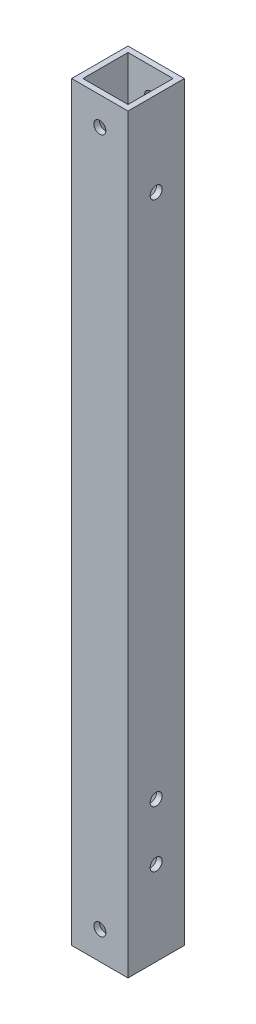
ISO-10303-21;
HEADER;
FILE_DESCRIPTION(('STEP AP214'),'2;1');
FILE_NAME('part.step','',(''),(''),'','','');
FILE_SCHEMA(('AUTOMOTIVE_DESIGN { 1 0 10303 214 1 1 1 1 }'));
ENDSEC;
DATA;
#1=APPLICATION_CONTEXT('core data for automotive mechanical design processes');
#2=APPLICATION_PROTOCOL_DEFINITION('international standard','automotive_design',2000,#1);
#3=PRODUCT_CONTEXT('',#1,'mechanical');
#4=PRODUCT('Part','Part','',(#3));
#5=PRODUCT_RELATED_PRODUCT_CATEGORY('part','',(#4));
#6=PRODUCT_DEFINITION_FORMATION('','',#4);
#7=PRODUCT_DEFINITION_CONTEXT('part definition',#1,'design');
#8=PRODUCT_DEFINITION('design','',#6,#7);
#9=PRODUCT_DEFINITION_SHAPE('','',#8);
#10=(LENGTH_UNIT() NAMED_UNIT(*) SI_UNIT(.MILLI.,.METRE.));
#11=(NAMED_UNIT(*) PLANE_ANGLE_UNIT() SI_UNIT($,.RADIAN.));
#12=(NAMED_UNIT(*) SI_UNIT($,.STERADIAN.) SOLID_ANGLE_UNIT());
#13=UNCERTAINTY_MEASURE_WITH_UNIT(LENGTH_MEASURE(1.E-05),#10,'distance_accuracy_value','');
#14=(GEOMETRIC_REPRESENTATION_CONTEXT(3) GLOBAL_UNCERTAINTY_ASSIGNED_CONTEXT((#13)) GLOBAL_UNIT_ASSIGNED_CONTEXT((#10,
#11,#12)) REPRESENTATION_CONTEXT('',''));
#15=CARTESIAN_POINT('',(0.,0.,0.));
#16=DIRECTION('',(0.,0.,1.));
#17=DIRECTION('',(1.,0.,0.));
#18=AXIS2_PLACEMENT_3D('',#15,#16,#17);
#19=CARTESIAN_POINT('',(0.,200.,0.));
#20=DIRECTION('',(0.,1.,0.));
#21=DIRECTION('',(0.,0.,1.));
#22=AXIS2_PLACEMENT_3D('',#19,#20,#21);
#23=PLANE('',#22);
#24=DIRECTION('',(0.,0.,-1.));
#25=VECTOR('',#24,1.);
#26=CARTESIAN_POINT('',(7.5,200.,-7.5));
#27=LINE('',#26,#25);
#28=CARTESIAN_POINT('',(7.5,200.,7.5));
#29=VERTEX_POINT('',#28);
#30=CARTESIAN_POINT('',(7.5,200.,-7.5));
#31=VERTEX_POINT('',#30);
#32=EDGE_CURVE('E156',#29,#31,#27,.T.);
#33=ORIENTED_EDGE('',*,*,#32,.T.);
#34=DIRECTION('',(-1.,0.,0.));
#35=VECTOR('',#34,1.);
#36=CARTESIAN_POINT('',(-7.5,200.,-7.5));
#37=LINE('',#36,#35);
#38=CARTESIAN_POINT('',(-7.5,200.,-7.5));
#39=VERTEX_POINT('',#38);
#40=EDGE_CURVE('E160',#31,#39,#37,.T.);
#41=ORIENTED_EDGE('',*,*,#40,.T.);
#42=DIRECTION('',(0.,0.,1.));
#43=VECTOR('',#42,1.);
#44=CARTESIAN_POINT('',(-7.5,200.,-7.5));
#45=LINE('',#44,#43);
#46=CARTESIAN_POINT('',(-7.5,200.,7.5));
#47=VERTEX_POINT('',#46);
#48=EDGE_CURVE('E164',#39,#47,#45,.T.);
#49=ORIENTED_EDGE('',*,*,#48,.T.);
#50=DIRECTION('',(1.,0.,0.));
#51=VECTOR('',#50,1.);
#52=CARTESIAN_POINT('',(-7.5,200.,7.5));
#53=LINE('',#52,#51);
#54=EDGE_CURVE('E167',#47,#29,#53,.T.);
#55=ORIENTED_EDGE('',*,*,#54,.T.);
#56=EDGE_LOOP('',(#33,#41,#49,#55));
#57=FACE_BOUND('',#56,.T.);
#58=DIRECTION('',(1.,0.,0.));
#59=VECTOR('',#58,1.);
#60=CARTESIAN_POINT('',(-6.,200.,6.));
#61=LINE('',#60,#59);
#62=CARTESIAN_POINT('',(-6.,200.,6.));
#63=VERTEX_POINT('',#62);
#64=CARTESIAN_POINT('',(6.,200.,6.));
#65=VERTEX_POINT('',#64);
#66=EDGE_CURVE('E115',#63,#65,#61,.T.);
#67=ORIENTED_EDGE('',*,*,#66,.F.);
#68=DIRECTION('',(0.,0.,1.));
#69=VECTOR('',#68,1.);
#70=CARTESIAN_POINT('',(-6.,200.,-6.));
#71=LINE('',#70,#69);
#72=CARTESIAN_POINT('',(-6.,200.,-6.));
#73=VERTEX_POINT('',#72);
#74=EDGE_CURVE('E106',#73,#63,#71,.T.);
#75=ORIENTED_EDGE('',*,*,#74,.F.);
#76=DIRECTION('',(-1.,0.,0.));
#77=VECTOR('',#76,1.);
#78=CARTESIAN_POINT('',(-6.,200.,-6.));
#79=LINE('',#78,#77);
#80=CARTESIAN_POINT('',(6.,200.,-6.));
#81=VERTEX_POINT('',#80);
#82=EDGE_CURVE('E132',#81,#73,#79,.T.);
#83=ORIENTED_EDGE('',*,*,#82,.F.);
#84=DIRECTION('',(0.,0.,-1.));
#85=VECTOR('',#84,1.);
#86=CARTESIAN_POINT('',(6.,200.,-6.));
#87=LINE('',#86,#85);
#88=EDGE_CURVE('E128',#65,#81,#87,.T.);
#89=ORIENTED_EDGE('',*,*,#88,.F.);
#90=EDGE_LOOP('',(#67,#75,#83,#89));
#91=FACE_BOUND('',#90,.T.);
#92=ADVANCED_FACE('F38',(#57,#91),#23,.T.);
#93=CARTESIAN_POINT('',(0.,0.,0.));
#94=DIRECTION('',(0.,1.,0.));
#95=DIRECTION('',(0.,0.,1.));
#96=AXIS2_PLACEMENT_3D('',#93,#94,#95);
#97=PLANE('',#96);
#98=DIRECTION('',(0.,0.,-1.));
#99=VECTOR('',#98,1.);
#100=CARTESIAN_POINT('',(7.5,0.,-7.5));
#101=LINE('',#100,#99);
#102=CARTESIAN_POINT('',(7.5,0.,7.5));
#103=VERTEX_POINT('',#102);
#104=CARTESIAN_POINT('',(7.5,0.,-7.5));
#105=VERTEX_POINT('',#104);
#106=EDGE_CURVE('E124',#103,#105,#101,.T.);
#107=ORIENTED_EDGE('',*,*,#106,.F.);
#108=DIRECTION('',(1.,0.,0.));
#109=VECTOR('',#108,1.);
#110=CARTESIAN_POINT('',(-7.5,0.,7.5));
#111=LINE('',#110,#109);
#112=CARTESIAN_POINT('',(-7.5,0.,7.5));
#113=VERTEX_POINT('',#112);
#114=EDGE_CURVE('E161',#113,#103,#111,.T.);
#115=ORIENTED_EDGE('',*,*,#114,.F.);
#116=DIRECTION('',(0.,0.,1.));
#117=VECTOR('',#116,1.);
#118=CARTESIAN_POINT('',(-7.5,0.,-7.5));
#119=LINE('',#118,#117);
#120=CARTESIAN_POINT('',(-7.5,0.,-7.5));
#121=VERTEX_POINT('',#120);
#122=EDGE_CURVE('E177',#121,#113,#119,.T.);
#123=ORIENTED_EDGE('',*,*,#122,.F.);
#124=DIRECTION('',(-1.,0.,0.));
#125=VECTOR('',#124,1.);
#126=CARTESIAN_POINT('',(-7.5,0.,-7.5));
#127=LINE('',#126,#125);
#128=EDGE_CURVE('E174',#105,#121,#127,.T.);
#129=ORIENTED_EDGE('',*,*,#128,.F.);
#130=EDGE_LOOP('',(#107,#115,#123,#129));
#131=FACE_BOUND('',#130,.T.);
#132=DIRECTION('',(0.,0.,1.));
#133=VECTOR('',#132,1.);
#134=CARTESIAN_POINT('',(-6.,0.,-6.));
#135=LINE('',#134,#133);
#136=CARTESIAN_POINT('',(-6.,0.,-6.));
#137=VERTEX_POINT('',#136);
#138=CARTESIAN_POINT('',(-6.,0.,6.));
#139=VERTEX_POINT('',#138);
#140=EDGE_CURVE('E64',#137,#139,#135,.T.);
#141=ORIENTED_EDGE('',*,*,#140,.T.);
#142=DIRECTION('',(1.,0.,0.));
#143=VECTOR('',#142,1.);
#144=CARTESIAN_POINT('',(-6.,0.,6.));
#145=LINE('',#144,#143);
#146=CARTESIAN_POINT('',(6.,0.,6.));
#147=VERTEX_POINT('',#146);
#148=EDGE_CURVE('E122',#139,#147,#145,.T.);
#149=ORIENTED_EDGE('',*,*,#148,.T.);
#150=DIRECTION('',(0.,0.,-1.));
#151=VECTOR('',#150,1.);
#152=CARTESIAN_POINT('',(6.,0.,-6.));
#153=LINE('',#152,#151);
#154=CARTESIAN_POINT('',(6.,0.,-6.));
#155=VERTEX_POINT('',#154);
#156=EDGE_CURVE('E143',#147,#155,#153,.T.);
#157=ORIENTED_EDGE('',*,*,#156,.T.);
#158=DIRECTION('',(-1.,0.,0.));
#159=VECTOR('',#158,1.);
#160=CARTESIAN_POINT('',(-6.,0.,-6.));
#161=LINE('',#160,#159);
#162=EDGE_CURVE('E116',#155,#137,#161,.T.);
#163=ORIENTED_EDGE('',*,*,#162,.T.);
#164=EDGE_LOOP('',(#141,#149,#157,#163));
#165=FACE_BOUND('',#164,.T.);
#166=ADVANCED_FACE('F283',(#131,#165),#97,.F.);
#167=CARTESIAN_POINT('',(7.5,200.,-7.5));
#168=DIRECTION('',(-1.,0.,0.));
#169=DIRECTION('',(0.,0.,1.));
#170=AXIS2_PLACEMENT_3D('',#167,#168,#169);
#171=PLANE('',#170);
#172=CARTESIAN_POINT('',(7.5,177.5,0.));
#173=DIRECTION('',(1.,0.,0.));
#174=DIRECTION('',(0.,0.,-1.));
#175=AXIS2_PLACEMENT_3D('',#172,#173,#174);
#176=CIRCLE('',#175,1.59999999999999);
#177=CARTESIAN_POINT('',(7.5,177.5,-1.59999999999999));
#178=VERTEX_POINT('',#177);
#179=EDGE_CURVE('E351',#178,#178,#176,.T.);
#180=ORIENTED_EDGE('',*,*,#179,.F.);
#181=EDGE_LOOP('',(#180));
#182=FACE_BOUND('',#181,.T.);
#183=CARTESIAN_POINT('',(7.5,22.5,0.));
#184=DIRECTION('',(1.,0.,0.));
#185=DIRECTION('',(0.,0.,-1.));
#186=AXIS2_PLACEMENT_3D('',#183,#184,#185);
#187=CIRCLE('',#186,1.6);
#188=CARTESIAN_POINT('',(7.5,22.5,-1.6));
#189=VERTEX_POINT('',#188);
#190=EDGE_CURVE('E361',#189,#189,#187,.T.);
#191=ORIENTED_EDGE('',*,*,#190,.F.);
#192=EDGE_LOOP('',(#191));
#193=FACE_BOUND('',#192,.T.);
#194=CARTESIAN_POINT('',(7.5,37.5,0.));
#195=DIRECTION('',(1.,0.,0.));
#196=DIRECTION('',(0.,0.,-1.));
#197=AXIS2_PLACEMENT_3D('',#194,#195,#196);
#198=CIRCLE('',#197,1.6);
#199=CARTESIAN_POINT('',(7.5,37.5,-1.6));
#200=VERTEX_POINT('',#199);
#201=EDGE_CURVE('E222',#200,#200,#198,.T.);
#202=ORIENTED_EDGE('',*,*,#201,.F.);
#203=EDGE_LOOP('',(#202));
#204=FACE_BOUND('',#203,.T.);
#205=ORIENTED_EDGE('',*,*,#106,.T.);
#206=DIRECTION('',(0.,-1.,0.));
#207=VECTOR('',#206,1.);
#208=CARTESIAN_POINT('',(7.5,200.,-7.5));
#209=LINE('',#208,#207);
#210=EDGE_CURVE('E11',#31,#105,#209,.T.);
#211=ORIENTED_EDGE('',*,*,#210,.F.);
#212=ORIENTED_EDGE('',*,*,#32,.F.);
#213=DIRECTION('',(0.,-1.,0.));
#214=VECTOR('',#213,1.);
#215=CARTESIAN_POINT('',(7.5,200.,7.5));
#216=LINE('',#215,#214);
#217=EDGE_CURVE('E170',#29,#103,#216,.T.);
#218=ORIENTED_EDGE('',*,*,#217,.T.);
#219=EDGE_LOOP('',(#205,#211,#212,#218));
#220=FACE_BOUND('',#219,.T.);
#221=ADVANCED_FACE('F40',(#182,#193,#204,#220),#171,.F.);
#222=CARTESIAN_POINT('',(-7.5,200.,-7.5));
#223=DIRECTION('',(0.,0.,1.));
#224=DIRECTION('',(1.,0.,0.));
#225=AXIS2_PLACEMENT_3D('',#222,#223,#224);
#226=PLANE('',#225);
#227=CARTESIAN_POINT('',(0.,192.5,-7.5));
#228=DIRECTION('',(0.,0.,1.));
#229=DIRECTION('',(1.,0.,0.));
#230=AXIS2_PLACEMENT_3D('',#227,#228,#229);
#231=CIRCLE('',#230,1.59999999999999);
#232=CARTESIAN_POINT('',(1.59999999999999,192.5,-7.5));
#233=VERTEX_POINT('',#232);
#234=EDGE_CURVE('E197',#233,#233,#231,.T.);
#235=ORIENTED_EDGE('',*,*,#234,.T.);
#236=EDGE_LOOP('',(#235));
#237=FACE_BOUND('',#236,.T.);
#238=CARTESIAN_POINT('',(0.,7.5,-7.5));
#239=DIRECTION('',(0.,0.,1.));
#240=DIRECTION('',(1.,0.,0.));
#241=AXIS2_PLACEMENT_3D('',#238,#239,#240);
#242=CIRCLE('',#241,1.6);
#243=CARTESIAN_POINT('',(1.6,7.5,-7.5));
#244=VERTEX_POINT('',#243);
#245=EDGE_CURVE('E237',#244,#244,#242,.T.);
#246=ORIENTED_EDGE('',*,*,#245,.T.);
#247=EDGE_LOOP('',(#246));
#248=FACE_BOUND('',#247,.T.);
#249=ORIENTED_EDGE('',*,*,#128,.T.);
#250=DIRECTION('',(0.,-1.,0.));
#251=VECTOR('',#250,1.);
#252=CARTESIAN_POINT('',(-7.5,200.,-7.5));
#253=LINE('',#252,#251);
#254=EDGE_CURVE('E48',#39,#121,#253,.T.);
#255=ORIENTED_EDGE('',*,*,#254,.F.);
#256=ORIENTED_EDGE('',*,*,#40,.F.);
#257=ORIENTED_EDGE('',*,*,#210,.T.);
#258=EDGE_LOOP('',(#249,#255,#256,#257));
#259=FACE_BOUND('',#258,.T.);
#260=ADVANCED_FACE('F287',(#237,#248,#259),#226,.F.);
#261=CARTESIAN_POINT('',(-7.5,200.,-7.5));
#262=DIRECTION('',(1.,0.,0.));
#263=DIRECTION('',(0.,0.,-1.));
#264=AXIS2_PLACEMENT_3D('',#261,#262,#263);
#265=PLANE('',#264);
#266=CARTESIAN_POINT('',(-7.5,177.5,0.));
#267=DIRECTION('',(1.,0.,0.));
#268=DIRECTION('',(0.,0.,-1.));
#269=AXIS2_PLACEMENT_3D('',#266,#267,#268);
#270=CIRCLE('',#269,1.59999999999999);
#271=CARTESIAN_POINT('',(-7.5,177.5,-1.59999999999999));
#272=VERTEX_POINT('',#271);
#273=EDGE_CURVE('E206',#272,#272,#270,.T.);
#274=ORIENTED_EDGE('',*,*,#273,.T.);
#275=EDGE_LOOP('',(#274));
#276=FACE_BOUND('',#275,.T.);
#277=CARTESIAN_POINT('',(-7.5,22.5,0.));
#278=DIRECTION('',(1.,0.,0.));
#279=DIRECTION('',(0.,0.,-1.));
#280=AXIS2_PLACEMENT_3D('',#277,#278,#279);
#281=CIRCLE('',#280,1.6);
#282=CARTESIAN_POINT('',(-7.5,22.5,-1.6));
#283=VERTEX_POINT('',#282);
#284=EDGE_CURVE('E355',#283,#283,#281,.T.);
#285=ORIENTED_EDGE('',*,*,#284,.T.);
#286=EDGE_LOOP('',(#285));
#287=FACE_BOUND('',#286,.T.);
#288=CARTESIAN_POINT('',(-7.5,37.5,0.));
#289=DIRECTION('',(1.,0.,0.));
#290=DIRECTION('',(0.,0.,-1.));
#291=AXIS2_PLACEMENT_3D('',#288,#289,#290);
#292=CIRCLE('',#291,1.6);
#293=CARTESIAN_POINT('',(-7.5,37.5,-1.6));
#294=VERTEX_POINT('',#293);
#295=EDGE_CURVE('E364',#294,#294,#292,.T.);
#296=ORIENTED_EDGE('',*,*,#295,.T.);
#297=EDGE_LOOP('',(#296));
#298=FACE_BOUND('',#297,.T.);
#299=ORIENTED_EDGE('',*,*,#122,.T.);
#300=DIRECTION('',(0.,-1.,0.));
#301=VECTOR('',#300,1.);
#302=CARTESIAN_POINT('',(-7.5,200.,7.5));
#303=LINE('',#302,#301);
#304=EDGE_CURVE('E185',#47,#113,#303,.T.);
#305=ORIENTED_EDGE('',*,*,#304,.F.);
#306=ORIENTED_EDGE('',*,*,#48,.F.);
#307=ORIENTED_EDGE('',*,*,#254,.T.);
#308=EDGE_LOOP('',(#299,#305,#306,#307));
#309=FACE_BOUND('',#308,.T.);
#310=ADVANCED_FACE('F270',(#276,#287,#298,#309),#265,.F.);
#311=CARTESIAN_POINT('',(-7.5,200.,7.5));
#312=DIRECTION('',(0.,0.,-1.));
#313=DIRECTION('',(-1.,0.,0.));
#314=AXIS2_PLACEMENT_3D('',#311,#312,#313);
#315=PLANE('',#314);
#316=CARTESIAN_POINT('',(0.,192.5,7.5));
#317=DIRECTION('',(0.,0.,1.));
#318=DIRECTION('',(1.,0.,0.));
#319=AXIS2_PLACEMENT_3D('',#316,#317,#318);
#320=CIRCLE('',#319,1.59999999999999);
#321=CARTESIAN_POINT('',(1.59999999999999,192.5,7.5));
#322=VERTEX_POINT('',#321);
#323=EDGE_CURVE('E233',#322,#322,#320,.T.);
#324=ORIENTED_EDGE('',*,*,#323,.F.);
#325=EDGE_LOOP('',(#324));
#326=FACE_BOUND('',#325,.T.);
#327=CARTESIAN_POINT('',(0.,7.5,7.5));
#328=DIRECTION('',(0.,0.,1.));
#329=DIRECTION('',(1.,0.,0.));
#330=AXIS2_PLACEMENT_3D('',#327,#328,#329);
#331=CIRCLE('',#330,1.6);
#332=CARTESIAN_POINT('',(1.6,7.5,7.5));
#333=VERTEX_POINT('',#332);
#334=EDGE_CURVE('E229',#333,#333,#331,.T.);
#335=ORIENTED_EDGE('',*,*,#334,.F.);
#336=EDGE_LOOP('',(#335));
#337=FACE_BOUND('',#336,.T.);
#338=ORIENTED_EDGE('',*,*,#114,.T.);
#339=ORIENTED_EDGE('',*,*,#217,.F.);
#340=ORIENTED_EDGE('',*,*,#54,.F.);
#341=ORIENTED_EDGE('',*,*,#304,.T.);
#342=EDGE_LOOP('',(#338,#339,#340,#341));
#343=FACE_BOUND('',#342,.T.);
#344=ADVANCED_FACE('F267',(#326,#337,#343),#315,.F.);
#345=CARTESIAN_POINT('',(-6.,200.,-6.));
#346=DIRECTION('',(1.,0.,0.));
#347=DIRECTION('',(0.,0.,-1.));
#348=AXIS2_PLACEMENT_3D('',#345,#346,#347);
#349=PLANE('',#348);
#350=CARTESIAN_POINT('',(-6.,177.5,0.));
#351=DIRECTION('',(1.,0.,0.));
#352=DIRECTION('',(0.,0.,-1.));
#353=AXIS2_PLACEMENT_3D('',#350,#351,#352);
#354=CIRCLE('',#353,1.59999999999999);
#355=CARTESIAN_POINT('',(-6.,177.5,-1.59999999999999));
#356=VERTEX_POINT('',#355);
#357=EDGE_CURVE('E225',#356,#356,#354,.T.);
#358=ORIENTED_EDGE('',*,*,#357,.F.);
#359=EDGE_LOOP('',(#358));
#360=FACE_BOUND('',#359,.T.);
#361=CARTESIAN_POINT('',(-6.,22.5,0.));
#362=DIRECTION('',(1.,0.,0.));
#363=DIRECTION('',(0.,0.,-1.));
#364=AXIS2_PLACEMENT_3D('',#361,#362,#363);
#365=CIRCLE('',#364,1.6);
#366=CARTESIAN_POINT('',(-6.,22.5,-1.6));
#367=VERTEX_POINT('',#366);
#368=EDGE_CURVE('E210',#367,#367,#365,.T.);
#369=ORIENTED_EDGE('',*,*,#368,.F.);
#370=EDGE_LOOP('',(#369));
#371=FACE_BOUND('',#370,.T.);
#372=CARTESIAN_POINT('',(-6.,37.5,0.));
#373=DIRECTION('',(1.,0.,0.));
#374=DIRECTION('',(0.,0.,-1.));
#375=AXIS2_PLACEMENT_3D('',#372,#373,#374);
#376=CIRCLE('',#375,1.6);
#377=CARTESIAN_POINT('',(-6.,37.5,-1.6));
#378=VERTEX_POINT('',#377);
#379=EDGE_CURVE('E205',#378,#378,#376,.T.);
#380=ORIENTED_EDGE('',*,*,#379,.F.);
#381=EDGE_LOOP('',(#380));
#382=FACE_BOUND('',#381,.T.);
#383=ORIENTED_EDGE('',*,*,#140,.F.);
#384=DIRECTION('',(0.,-1.,0.));
#385=VECTOR('',#384,1.);
#386=CARTESIAN_POINT('',(-6.,200.,-6.));
#387=LINE('',#386,#385);
#388=EDGE_CURVE('E110',#73,#137,#387,.T.);
#389=ORIENTED_EDGE('',*,*,#388,.F.);
#390=ORIENTED_EDGE('',*,*,#74,.T.);
#391=DIRECTION('',(0.,-1.,0.));
#392=VECTOR('',#391,1.);
#393=CARTESIAN_POINT('',(-6.,200.,6.));
#394=LINE('',#393,#392);
#395=EDGE_CURVE('E109',#63,#139,#394,.T.);
#396=ORIENTED_EDGE('',*,*,#395,.T.);
#397=EDGE_LOOP('',(#383,#389,#390,#396));
#398=FACE_BOUND('',#397,.T.);
#399=ADVANCED_FACE('F108',(#360,#371,#382,#398),#349,.T.);
#400=CARTESIAN_POINT('',(-6.,200.,6.));
#401=DIRECTION('',(0.,0.,-1.));
#402=DIRECTION('',(-1.,0.,0.));
#403=AXIS2_PLACEMENT_3D('',#400,#401,#402);
#404=PLANE('',#403);
#405=CARTESIAN_POINT('',(0.,192.5,6.));
#406=DIRECTION('',(0.,0.,-1.));
#407=DIRECTION('',(-1.,0.,0.));
#408=AXIS2_PLACEMENT_3D('',#405,#406,#407);
#409=CIRCLE('',#408,1.59999999999999);
#410=CARTESIAN_POINT('',(-1.59999999999999,192.5,6.));
#411=VERTEX_POINT('',#410);
#412=EDGE_CURVE('E140',#411,#411,#409,.T.);
#413=ORIENTED_EDGE('',*,*,#412,.F.);
#414=EDGE_LOOP('',(#413));
#415=FACE_BOUND('',#414,.T.);
#416=CARTESIAN_POINT('',(0.,7.5,6.));
#417=DIRECTION('',(0.,0.,-1.));
#418=DIRECTION('',(-1.,0.,0.));
#419=AXIS2_PLACEMENT_3D('',#416,#417,#418);
#420=CIRCLE('',#419,1.6);
#421=CARTESIAN_POINT('',(-1.6,7.5,6.));
#422=VERTEX_POINT('',#421);
#423=EDGE_CURVE('E196',#422,#422,#420,.T.);
#424=ORIENTED_EDGE('',*,*,#423,.F.);
#425=EDGE_LOOP('',(#424));
#426=FACE_BOUND('',#425,.T.);
#427=ORIENTED_EDGE('',*,*,#148,.F.);
#428=ORIENTED_EDGE('',*,*,#395,.F.);
#429=ORIENTED_EDGE('',*,*,#66,.T.);
#430=DIRECTION('',(0.,-1.,0.));
#431=VECTOR('',#430,1.);
#432=CARTESIAN_POINT('',(6.,200.,6.));
#433=LINE('',#432,#431);
#434=EDGE_CURVE('E125',#65,#147,#433,.T.);
#435=ORIENTED_EDGE('',*,*,#434,.T.);
#436=EDGE_LOOP('',(#427,#428,#429,#435));
#437=FACE_BOUND('',#436,.T.);
#438=ADVANCED_FACE('F119',(#415,#426,#437),#404,.T.);
#439=CARTESIAN_POINT('',(6.,200.,-6.));
#440=DIRECTION('',(-1.,0.,0.));
#441=DIRECTION('',(0.,0.,1.));
#442=AXIS2_PLACEMENT_3D('',#439,#440,#441);
#443=PLANE('',#442);
#444=CARTESIAN_POINT('',(6.,177.5,0.));
#445=DIRECTION('',(-1.,0.,0.));
#446=DIRECTION('',(0.,0.,1.));
#447=AXIS2_PLACEMENT_3D('',#444,#445,#446);
#448=CIRCLE('',#447,1.59999999999999);
#449=CARTESIAN_POINT('',(6.,177.5,1.59999999999999));
#450=VERTEX_POINT('',#449);
#451=EDGE_CURVE('E42',#450,#450,#448,.T.);
#452=ORIENTED_EDGE('',*,*,#451,.F.);
#453=EDGE_LOOP('',(#452));
#454=FACE_BOUND('',#453,.T.);
#455=CARTESIAN_POINT('',(6.,22.5,0.));
#456=DIRECTION('',(-1.,0.,0.));
#457=DIRECTION('',(0.,0.,1.));
#458=AXIS2_PLACEMENT_3D('',#455,#456,#457);
#459=CIRCLE('',#458,1.6);
#460=CARTESIAN_POINT('',(6.,22.5,1.6));
#461=VERTEX_POINT('',#460);
#462=EDGE_CURVE('E207',#461,#461,#459,.T.);
#463=ORIENTED_EDGE('',*,*,#462,.F.);
#464=EDGE_LOOP('',(#463));
#465=FACE_BOUND('',#464,.T.);
#466=CARTESIAN_POINT('',(6.,37.5,0.));
#467=DIRECTION('',(-1.,0.,0.));
#468=DIRECTION('',(0.,0.,1.));
#469=AXIS2_PLACEMENT_3D('',#466,#467,#468);
#470=CIRCLE('',#469,1.6);
#471=CARTESIAN_POINT('',(6.,37.5,1.6));
#472=VERTEX_POINT('',#471);
#473=EDGE_CURVE('E202',#472,#472,#470,.T.);
#474=ORIENTED_EDGE('',*,*,#473,.F.);
#475=EDGE_LOOP('',(#474));
#476=FACE_BOUND('',#475,.T.);
#477=ORIENTED_EDGE('',*,*,#156,.F.);
#478=ORIENTED_EDGE('',*,*,#434,.F.);
#479=ORIENTED_EDGE('',*,*,#88,.T.);
#480=DIRECTION('',(0.,-1.,0.));
#481=VECTOR('',#480,1.);
#482=CARTESIAN_POINT('',(6.,200.,-6.));
#483=LINE('',#482,#481);
#484=EDGE_CURVE('E56',#81,#155,#483,.T.);
#485=ORIENTED_EDGE('',*,*,#484,.T.);
#486=EDGE_LOOP('',(#477,#478,#479,#485));
#487=FACE_BOUND('',#486,.T.);
#488=ADVANCED_FACE('F255',(#454,#465,#476,#487),#443,.T.);
#489=CARTESIAN_POINT('',(-6.,200.,-6.));
#490=DIRECTION('',(0.,0.,1.));
#491=DIRECTION('',(1.,0.,0.));
#492=AXIS2_PLACEMENT_3D('',#489,#490,#491);
#493=PLANE('',#492);
#494=CARTESIAN_POINT('',(0.,192.5,-6.));
#495=DIRECTION('',(0.,0.,1.));
#496=DIRECTION('',(1.,0.,0.));
#497=AXIS2_PLACEMENT_3D('',#494,#495,#496);
#498=CIRCLE('',#497,1.59999999999999);
#499=CARTESIAN_POINT('',(1.59999999999999,192.5,-6.));
#500=VERTEX_POINT('',#499);
#501=EDGE_CURVE('E198',#500,#500,#498,.T.);
#502=ORIENTED_EDGE('',*,*,#501,.F.);
#503=EDGE_LOOP('',(#502));
#504=FACE_BOUND('',#503,.T.);
#505=CARTESIAN_POINT('',(0.,7.5,-6.));
#506=DIRECTION('',(0.,0.,1.));
#507=DIRECTION('',(1.,0.,0.));
#508=AXIS2_PLACEMENT_3D('',#505,#506,#507);
#509=CIRCLE('',#508,1.6);
#510=CARTESIAN_POINT('',(1.6,7.5,-6.));
#511=VERTEX_POINT('',#510);
#512=EDGE_CURVE('E192',#511,#511,#509,.T.);
#513=ORIENTED_EDGE('',*,*,#512,.F.);
#514=EDGE_LOOP('',(#513));
#515=FACE_BOUND('',#514,.T.);
#516=ORIENTED_EDGE('',*,*,#162,.F.);
#517=ORIENTED_EDGE('',*,*,#484,.F.);
#518=ORIENTED_EDGE('',*,*,#82,.T.);
#519=ORIENTED_EDGE('',*,*,#388,.T.);
#520=EDGE_LOOP('',(#516,#517,#518,#519));
#521=FACE_BOUND('',#520,.T.);
#522=ADVANCED_FACE('F313',(#504,#515,#521),#493,.T.);
#523=CARTESIAN_POINT('',(0.,7.5,-7.5));
#524=DIRECTION('',(0.,0.,1.));
#525=DIRECTION('',(1.,0.,0.));
#526=AXIS2_PLACEMENT_3D('',#523,#524,#525);
#527=CYLINDRICAL_SURFACE('',#526,1.6);
#528=ORIENTED_EDGE('',*,*,#512,.T.);
#529=EDGE_LOOP('',(#528));
#530=FACE_BOUND('',#529,.T.);
#531=ORIENTED_EDGE('',*,*,#245,.F.);
#532=EDGE_LOOP('',(#531));
#533=FACE_BOUND('',#532,.T.);
#534=ADVANCED_FACE('F264',(#530,#533),#527,.F.);
#535=CARTESIAN_POINT('',(0.,192.5,-7.5));
#536=DIRECTION('',(0.,0.,1.));
#537=DIRECTION('',(1.,0.,0.));
#538=AXIS2_PLACEMENT_3D('',#535,#536,#537);
#539=CYLINDRICAL_SURFACE('',#538,1.59999999999999);
#540=ORIENTED_EDGE('',*,*,#501,.T.);
#541=EDGE_LOOP('',(#540));
#542=FACE_BOUND('',#541,.T.);
#543=ORIENTED_EDGE('',*,*,#234,.F.);
#544=EDGE_LOOP('',(#543));
#545=FACE_BOUND('',#544,.T.);
#546=ADVANCED_FACE('F262',(#542,#545),#539,.F.);
#547=ORIENTED_EDGE('',*,*,#423,.T.);
#548=EDGE_LOOP('',(#547));
#549=FACE_BOUND('',#548,.T.);
#550=ORIENTED_EDGE('',*,*,#334,.T.);
#551=EDGE_LOOP('',(#550));
#552=FACE_BOUND('',#551,.T.);
#553=ADVANCED_FACE('F259',(#549,#552),#527,.F.);
#554=ORIENTED_EDGE('',*,*,#412,.T.);
#555=EDGE_LOOP('',(#554));
#556=FACE_BOUND('',#555,.T.);
#557=ORIENTED_EDGE('',*,*,#323,.T.);
#558=EDGE_LOOP('',(#557));
#559=FACE_BOUND('',#558,.T.);
#560=ADVANCED_FACE('F250',(#556,#559),#539,.F.);
#561=CARTESIAN_POINT('',(-7.5,37.5,0.));
#562=DIRECTION('',(1.,0.,0.));
#563=DIRECTION('',(0.,0.,-1.));
#564=AXIS2_PLACEMENT_3D('',#561,#562,#563);
#565=CYLINDRICAL_SURFACE('',#564,1.6);
#566=ORIENTED_EDGE('',*,*,#473,.T.);
#567=EDGE_LOOP('',(#566));
#568=FACE_BOUND('',#567,.T.);
#569=ORIENTED_EDGE('',*,*,#201,.T.);
#570=EDGE_LOOP('',(#569));
#571=FACE_BOUND('',#570,.T.);
#572=ADVANCED_FACE('F323',(#568,#571),#565,.F.);
#573=CARTESIAN_POINT('',(-7.5,22.5,0.));
#574=DIRECTION('',(1.,0.,0.));
#575=DIRECTION('',(0.,0.,-1.));
#576=AXIS2_PLACEMENT_3D('',#573,#574,#575);
#577=CYLINDRICAL_SURFACE('',#576,1.6);
#578=ORIENTED_EDGE('',*,*,#462,.T.);
#579=EDGE_LOOP('',(#578));
#580=FACE_BOUND('',#579,.T.);
#581=ORIENTED_EDGE('',*,*,#190,.T.);
#582=EDGE_LOOP('',(#581));
#583=FACE_BOUND('',#582,.T.);
#584=ADVANCED_FACE('F326',(#580,#583),#577,.F.);
#585=CARTESIAN_POINT('',(-7.5,177.5,0.));
#586=DIRECTION('',(1.,0.,0.));
#587=DIRECTION('',(0.,0.,-1.));
#588=AXIS2_PLACEMENT_3D('',#585,#586,#587);
#589=CYLINDRICAL_SURFACE('',#588,1.59999999999999);
#590=ORIENTED_EDGE('',*,*,#451,.T.);
#591=EDGE_LOOP('',(#590));
#592=FACE_BOUND('',#591,.T.);
#593=ORIENTED_EDGE('',*,*,#179,.T.);
#594=EDGE_LOOP('',(#593));
#595=FACE_BOUND('',#594,.T.);
#596=ADVANCED_FACE('F331',(#592,#595),#589,.F.);
#597=ORIENTED_EDGE('',*,*,#379,.T.);
#598=EDGE_LOOP('',(#597));
#599=FACE_BOUND('',#598,.T.);
#600=ORIENTED_EDGE('',*,*,#295,.F.);
#601=EDGE_LOOP('',(#600));
#602=FACE_BOUND('',#601,.T.);
#603=ADVANCED_FACE('F328',(#599,#602),#565,.F.);
#604=ORIENTED_EDGE('',*,*,#368,.T.);
#605=EDGE_LOOP('',(#604));
#606=FACE_BOUND('',#605,.T.);
#607=ORIENTED_EDGE('',*,*,#284,.F.);
#608=EDGE_LOOP('',(#607));
#609=FACE_BOUND('',#608,.T.);
#610=ADVANCED_FACE('F332',(#606,#609),#577,.F.);
#611=ORIENTED_EDGE('',*,*,#357,.T.);
#612=EDGE_LOOP('',(#611));
#613=FACE_BOUND('',#612,.T.);
#614=ORIENTED_EDGE('',*,*,#273,.F.);
#615=EDGE_LOOP('',(#614));
#616=FACE_BOUND('',#615,.T.);
#617=ADVANCED_FACE('F335',(#613,#616),#589,.F.);
#618=CLOSED_SHELL('',(#92,#166,#221,#260,#310,#344,#399,#438,#488,#522,#534,#546,#553,#560,#572,
#584,#596,#603,#610,#617));
#619=MANIFOLD_SOLID_BREP('B2',#618);
#620=ADVANCED_BREP_SHAPE_REPRESENTATION('',(#18,#619),#14);
#621=SHAPE_DEFINITION_REPRESENTATION(#9,#620);
ENDSEC;
END-ISO-10303-21;
